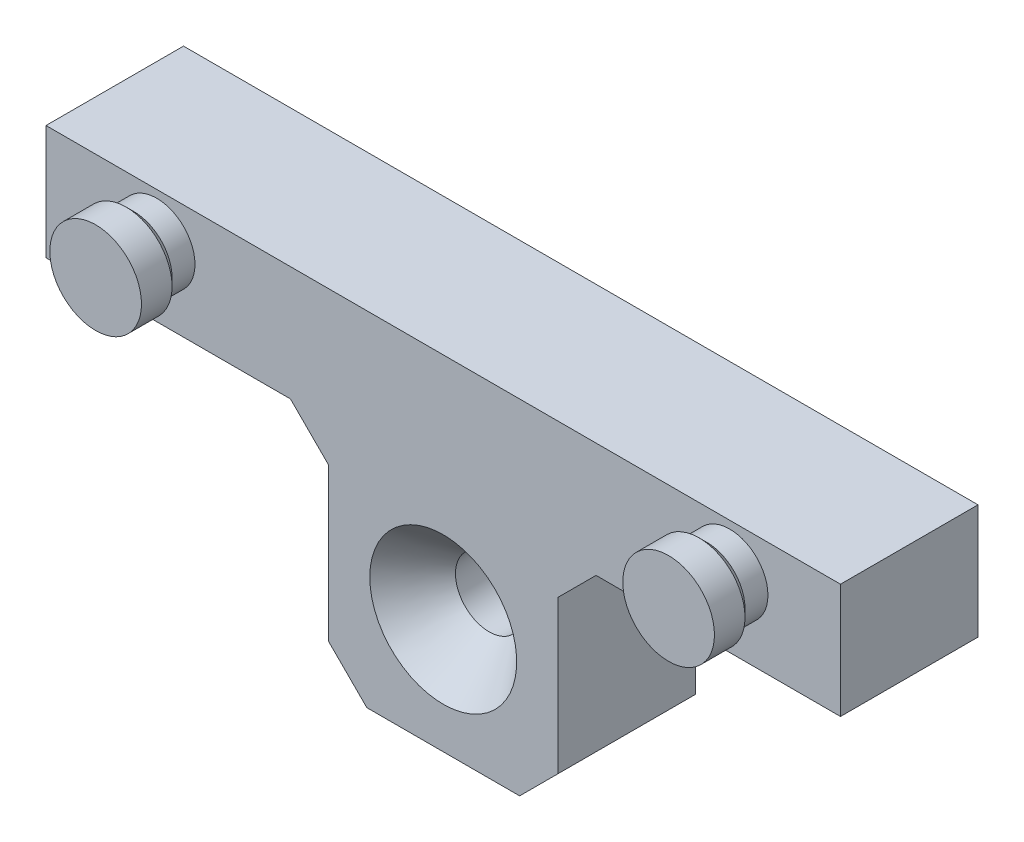
ISO-10303-21;
HEADER;
FILE_DESCRIPTION(('STEP AP214'),'2;1');
FILE_NAME('part.step','',(''),(''),'','','');
FILE_SCHEMA(('AUTOMOTIVE_DESIGN { 1 0 10303 214 1 1 1 1 }'));
ENDSEC;
DATA;
#1=APPLICATION_CONTEXT('core data for automotive mechanical design processes');
#2=APPLICATION_PROTOCOL_DEFINITION('international standard','automotive_design',2000,#1);
#3=PRODUCT_CONTEXT('',#1,'mechanical');
#4=PRODUCT('Part','Part','',(#3));
#5=PRODUCT_RELATED_PRODUCT_CATEGORY('part','',(#4));
#6=PRODUCT_DEFINITION_FORMATION('','',#4);
#7=PRODUCT_DEFINITION_CONTEXT('part definition',#1,'design');
#8=PRODUCT_DEFINITION('design','',#6,#7);
#9=PRODUCT_DEFINITION_SHAPE('','',#8);
#10=(LENGTH_UNIT() NAMED_UNIT(*) SI_UNIT(.MILLI.,.METRE.));
#11=(NAMED_UNIT(*) PLANE_ANGLE_UNIT() SI_UNIT($,.RADIAN.));
#12=(NAMED_UNIT(*) SI_UNIT($,.STERADIAN.) SOLID_ANGLE_UNIT());
#13=UNCERTAINTY_MEASURE_WITH_UNIT(LENGTH_MEASURE(1.E-05),#10,'distance_accuracy_value','');
#14=(GEOMETRIC_REPRESENTATION_CONTEXT(3) GLOBAL_UNCERTAINTY_ASSIGNED_CONTEXT((#13)) GLOBAL_UNIT_ASSIGNED_CONTEXT((#10,
#11,#12)) REPRESENTATION_CONTEXT('',''));
#15=CARTESIAN_POINT('',(0.,0.,0.));
#16=DIRECTION('',(0.,0.,1.));
#17=DIRECTION('',(1.,0.,0.));
#18=AXIS2_PLACEMENT_3D('',#15,#16,#17);
#19=CARTESIAN_POINT('',(26.,-15.,9.));
#20=DIRECTION('',(0.,0.,-1.));
#21=DIRECTION('',(-1.,0.,0.));
#22=AXIS2_PLACEMENT_3D('',#19,#20,#21);
#23=CYLINDRICAL_SURFACE('',#22,2.2);
#24=CARTESIAN_POINT('',(26.,-15.,0.));
#25=DIRECTION('',(0.,0.,1.));
#26=DIRECTION('',(1.,0.,0.));
#27=AXIS2_PLACEMENT_3D('',#24,#25,#26);
#28=CIRCLE('',#27,2.2);
#29=CARTESIAN_POINT('',(28.2,-15.,0.));
#30=VERTEX_POINT('',#29);
#31=EDGE_CURVE('E197',#30,#30,#28,.T.);
#32=ORIENTED_EDGE('',*,*,#31,.F.);
#33=EDGE_LOOP('',(#32));
#34=FACE_BOUND('',#33,.T.);
#35=CARTESIAN_POINT('',(26.,-15.,6.));
#36=DIRECTION('',(0.,0.,-1.));
#37=DIRECTION('',(-1.,0.,0.));
#38=AXIS2_PLACEMENT_3D('',#35,#36,#37);
#39=CIRCLE('',#38,2.2);
#40=CARTESIAN_POINT('',(23.8,-15.,6.));
#41=VERTEX_POINT('',#40);
#42=EDGE_CURVE('E655',#41,#41,#39,.T.);
#43=ORIENTED_EDGE('',*,*,#42,.F.);
#44=EDGE_LOOP('',(#43));
#45=FACE_BOUND('',#44,.T.);
#46=ADVANCED_FACE('F48',(#34,#45),#23,.F.);
#47=CARTESIAN_POINT('',(52.,0.,9.));
#48=DIRECTION('',(1.,0.,0.));
#49=DIRECTION('',(0.,0.,-1.));
#50=AXIS2_PLACEMENT_3D('',#47,#48,#49);
#51=PLANE('',#50);
#52=DIRECTION('',(0.,-1.,0.));
#53=VECTOR('',#52,1.);
#54=CARTESIAN_POINT('',(52.,0.,0.));
#55=LINE('',#54,#53);
#56=CARTESIAN_POINT('',(52.,0.,0.));
#57=VERTEX_POINT('',#56);
#58=CARTESIAN_POINT('',(52.,-7.49999999999999,0.));
#59=VERTEX_POINT('',#58);
#60=EDGE_CURVE('E144',#57,#59,#55,.T.);
#61=ORIENTED_EDGE('',*,*,#60,.F.);
#62=DIRECTION('',(0.,0.,-1.));
#63=VECTOR('',#62,1.);
#64=CARTESIAN_POINT('',(52.,0.,9.));
#65=LINE('',#64,#63);
#66=CARTESIAN_POINT('',(52.,0.,9.));
#67=VERTEX_POINT('',#66);
#68=EDGE_CURVE('E138',#67,#57,#65,.T.);
#69=ORIENTED_EDGE('',*,*,#68,.F.);
#70=DIRECTION('',(0.,-1.,0.));
#71=VECTOR('',#70,1.);
#72=CARTESIAN_POINT('',(52.,0.,9.));
#73=LINE('',#72,#71);
#74=CARTESIAN_POINT('',(52.,-7.49999999999999,9.));
#75=VERTEX_POINT('',#74);
#76=EDGE_CURVE('E142',#67,#75,#73,.T.);
#77=ORIENTED_EDGE('',*,*,#76,.T.);
#78=DIRECTION('',(0.,0.,-1.));
#79=VECTOR('',#78,1.);
#80=CARTESIAN_POINT('',(52.,-7.49999999999999,9.));
#81=LINE('',#80,#79);
#82=EDGE_CURVE('E201',#75,#59,#81,.T.);
#83=ORIENTED_EDGE('',*,*,#82,.T.);
#84=EDGE_LOOP('',(#61,#69,#77,#83));
#85=FACE_BOUND('',#84,.T.);
#86=ADVANCED_FACE('F140',(#85),#51,.T.);
#87=CARTESIAN_POINT('',(0.,0.,9.));
#88=DIRECTION('',(0.,1.,0.));
#89=DIRECTION('',(0.,0.,1.));
#90=AXIS2_PLACEMENT_3D('',#87,#88,#89);
#91=PLANE('',#90);
#92=DIRECTION('',(1.,0.,0.));
#93=VECTOR('',#92,1.);
#94=CARTESIAN_POINT('',(0.,0.,0.));
#95=LINE('',#94,#93);
#96=CARTESIAN_POINT('',(0.,0.,0.));
#97=VERTEX_POINT('',#96);
#98=EDGE_CURVE('E179',#97,#57,#95,.T.);
#99=ORIENTED_EDGE('',*,*,#98,.F.);
#100=DIRECTION('',(0.,0.,-1.));
#101=VECTOR('',#100,1.);
#102=CARTESIAN_POINT('',(0.,0.,9.));
#103=LINE('',#102,#101);
#104=CARTESIAN_POINT('',(0.,0.,9.));
#105=VERTEX_POINT('',#104);
#106=EDGE_CURVE('E150',#105,#97,#103,.T.);
#107=ORIENTED_EDGE('',*,*,#106,.F.);
#108=DIRECTION('',(1.,0.,0.));
#109=VECTOR('',#108,1.);
#110=CARTESIAN_POINT('',(0.,0.,9.));
#111=LINE('',#110,#109);
#112=EDGE_CURVE('E156',#105,#67,#111,.T.);
#113=ORIENTED_EDGE('',*,*,#112,.T.);
#114=ORIENTED_EDGE('',*,*,#68,.T.);
#115=EDGE_LOOP('',(#99,#107,#113,#114));
#116=FACE_BOUND('',#115,.T.);
#117=ADVANCED_FACE('F162',(#116),#91,.T.);
#118=CARTESIAN_POINT('',(0.,0.,9.));
#119=DIRECTION('',(1.,0.,0.));
#120=DIRECTION('',(0.,1.,0.));
#121=AXIS2_PLACEMENT_3D('',#118,#119,#120);
#122=PLANE('',#121);
#123=DIRECTION('',(0.,-1.,0.));
#124=VECTOR('',#123,1.);
#125=CARTESIAN_POINT('',(0.,0.,0.));
#126=LINE('',#125,#124);
#127=CARTESIAN_POINT('',(0.,-7.5,0.));
#128=VERTEX_POINT('',#127);
#129=EDGE_CURVE('E182',#97,#128,#126,.T.);
#130=ORIENTED_EDGE('',*,*,#129,.T.);
#131=DIRECTION('',(0.,0.,-1.));
#132=VECTOR('',#131,1.);
#133=CARTESIAN_POINT('',(0.,-7.5,9.));
#134=LINE('',#133,#132);
#135=CARTESIAN_POINT('',(0.,-7.5,9.));
#136=VERTEX_POINT('',#135);
#137=EDGE_CURVE('E203',#136,#128,#134,.T.);
#138=ORIENTED_EDGE('',*,*,#137,.F.);
#139=DIRECTION('',(0.,-1.,0.));
#140=VECTOR('',#139,1.);
#141=CARTESIAN_POINT('',(0.,0.,9.));
#142=LINE('',#141,#140);
#143=EDGE_CURVE('E164',#105,#136,#142,.T.);
#144=ORIENTED_EDGE('',*,*,#143,.F.);
#145=ORIENTED_EDGE('',*,*,#106,.T.);
#146=EDGE_LOOP('',(#130,#138,#144,#145));
#147=FACE_BOUND('',#146,.T.);
#148=ADVANCED_FACE('F280',(#147),#122,.F.);
#149=CARTESIAN_POINT('',(0.,-7.5,9.));
#150=DIRECTION('',(0.,1.,0.));
#151=DIRECTION('',(-1.,0.,0.));
#152=AXIS2_PLACEMENT_3D('',#149,#150,#151);
#153=PLANE('',#152);
#154=DIRECTION('',(1.,0.,0.));
#155=VECTOR('',#154,1.);
#156=CARTESIAN_POINT('',(0.,-7.5,0.));
#157=LINE('',#156,#155);
#158=CARTESIAN_POINT('',(16.,-7.5,0.));
#159=VERTEX_POINT('',#158);
#160=EDGE_CURVE('E185',#128,#159,#157,.T.);
#161=ORIENTED_EDGE('',*,*,#160,.T.);
#162=DIRECTION('',(0.,0.,1.));
#163=VECTOR('',#162,1.);
#164=CARTESIAN_POINT('',(16.,-7.5,9.));
#165=LINE('',#164,#163);
#166=CARTESIAN_POINT('',(16.,-7.5,9.));
#167=VERTEX_POINT('',#166);
#168=EDGE_CURVE('E237',#159,#167,#165,.T.);
#169=ORIENTED_EDGE('',*,*,#168,.T.);
#170=DIRECTION('',(1.,0.,0.));
#171=VECTOR('',#170,1.);
#172=CARTESIAN_POINT('',(0.,-7.5,9.));
#173=LINE('',#172,#171);
#174=EDGE_CURVE('E166',#136,#167,#173,.T.);
#175=ORIENTED_EDGE('',*,*,#174,.F.);
#176=ORIENTED_EDGE('',*,*,#137,.T.);
#177=EDGE_LOOP('',(#161,#169,#175,#176));
#178=FACE_BOUND('',#177,.T.);
#179=ADVANCED_FACE('F251',(#178),#153,.F.);
#180=CARTESIAN_POINT('',(18.5,0.,9.));
#181=DIRECTION('',(1.,0.,0.));
#182=DIRECTION('',(0.,1.,0.));
#183=AXIS2_PLACEMENT_3D('',#180,#181,#182);
#184=PLANE('',#183);
#185=DIRECTION('',(0.,-1.,0.));
#186=VECTOR('',#185,1.);
#187=CARTESIAN_POINT('',(18.5,0.,0.));
#188=LINE('',#187,#186);
#189=CARTESIAN_POINT('',(18.5,-10.,0.));
#190=VERTEX_POINT('',#189);
#191=CARTESIAN_POINT('',(18.5,-20.,0.));
#192=VERTEX_POINT('',#191);
#193=EDGE_CURVE('E188',#190,#192,#188,.T.);
#194=ORIENTED_EDGE('',*,*,#193,.T.);
#195=DIRECTION('',(0.,0.,1.));
#196=VECTOR('',#195,1.);
#197=CARTESIAN_POINT('',(18.5,-20.,9.));
#198=LINE('',#197,#196);
#199=CARTESIAN_POINT('',(18.5,-20.,9.));
#200=VERTEX_POINT('',#199);
#201=EDGE_CURVE('E64',#192,#200,#198,.T.);
#202=ORIENTED_EDGE('',*,*,#201,.T.);
#203=DIRECTION('',(0.,-1.,0.));
#204=VECTOR('',#203,1.);
#205=CARTESIAN_POINT('',(18.5,0.,9.));
#206=LINE('',#205,#204);
#207=CARTESIAN_POINT('',(18.5,-10.,9.));
#208=VERTEX_POINT('',#207);
#209=EDGE_CURVE('E171',#208,#200,#206,.T.);
#210=ORIENTED_EDGE('',*,*,#209,.F.);
#211=DIRECTION('',(0.,0.,-1.));
#212=VECTOR('',#211,1.);
#213=CARTESIAN_POINT('',(18.5,-10.,0.));
#214=LINE('',#213,#212);
#215=EDGE_CURVE('E233',#208,#190,#214,.T.);
#216=ORIENTED_EDGE('',*,*,#215,.T.);
#217=EDGE_LOOP('',(#194,#202,#210,#216));
#218=FACE_BOUND('',#217,.T.);
#219=ADVANCED_FACE('F253',(#218),#184,.F.);
#220=CARTESIAN_POINT('',(0.,-22.5,9.));
#221=DIRECTION('',(0.,1.,0.));
#222=DIRECTION('',(0.,0.,1.));
#223=AXIS2_PLACEMENT_3D('',#220,#221,#222);
#224=PLANE('',#223);
#225=DIRECTION('',(1.,0.,0.));
#226=VECTOR('',#225,1.);
#227=CARTESIAN_POINT('',(0.,-22.5,0.));
#228=LINE('',#227,#226);
#229=CARTESIAN_POINT('',(21.,-22.5,0.));
#230=VERTEX_POINT('',#229);
#231=CARTESIAN_POINT('',(31.,-22.5,0.));
#232=VERTEX_POINT('',#231);
#233=EDGE_CURVE('E191',#230,#232,#228,.T.);
#234=ORIENTED_EDGE('',*,*,#233,.T.);
#235=DIRECTION('',(0.,0.,1.));
#236=VECTOR('',#235,1.);
#237=CARTESIAN_POINT('',(31.,-22.5,9.));
#238=LINE('',#237,#236);
#239=CARTESIAN_POINT('',(31.,-22.5,9.));
#240=VERTEX_POINT('',#239);
#241=EDGE_CURVE('E227',#232,#240,#238,.T.);
#242=ORIENTED_EDGE('',*,*,#241,.T.);
#243=DIRECTION('',(1.,0.,0.));
#244=VECTOR('',#243,1.);
#245=CARTESIAN_POINT('',(0.,-22.5,9.));
#246=LINE('',#245,#244);
#247=CARTESIAN_POINT('',(21.,-22.5,9.));
#248=VERTEX_POINT('',#247);
#249=EDGE_CURVE('E173',#248,#240,#246,.T.);
#250=ORIENTED_EDGE('',*,*,#249,.F.);
#251=DIRECTION('',(0.,0.,-1.));
#252=VECTOR('',#251,1.);
#253=CARTESIAN_POINT('',(21.,-22.5,9.));
#254=LINE('',#253,#252);
#255=EDGE_CURVE('E224',#248,#230,#254,.T.);
#256=ORIENTED_EDGE('',*,*,#255,.T.);
#257=EDGE_LOOP('',(#234,#242,#250,#256));
#258=FACE_BOUND('',#257,.T.);
#259=ADVANCED_FACE('F261',(#258),#224,.F.);
#260=CARTESIAN_POINT('',(33.5,0.,9.));
#261=DIRECTION('',(1.,0.,0.));
#262=DIRECTION('',(0.,0.,-1.));
#263=AXIS2_PLACEMENT_3D('',#260,#261,#262);
#264=PLANE('',#263);
#265=DIRECTION('',(0.,-1.,0.));
#266=VECTOR('',#265,1.);
#267=CARTESIAN_POINT('',(33.5,0.,0.));
#268=LINE('',#267,#266);
#269=CARTESIAN_POINT('',(33.5,-9.99999999999999,0.));
#270=VERTEX_POINT('',#269);
#271=CARTESIAN_POINT('',(33.5,-20.,0.));
#272=VERTEX_POINT('',#271);
#273=EDGE_CURVE('E194',#270,#272,#268,.T.);
#274=ORIENTED_EDGE('',*,*,#273,.F.);
#275=DIRECTION('',(0.,0.,1.));
#276=VECTOR('',#275,1.);
#277=CARTESIAN_POINT('',(33.5,-9.99999999999999,9.));
#278=LINE('',#277,#276);
#279=CARTESIAN_POINT('',(33.5,-9.99999999999999,9.));
#280=VERTEX_POINT('',#279);
#281=EDGE_CURVE('E218',#270,#280,#278,.T.);
#282=ORIENTED_EDGE('',*,*,#281,.T.);
#283=DIRECTION('',(0.,-1.,0.));
#284=VECTOR('',#283,1.);
#285=CARTESIAN_POINT('',(33.5,0.,9.));
#286=LINE('',#285,#284);
#287=CARTESIAN_POINT('',(33.5,-20.,9.));
#288=VERTEX_POINT('',#287);
#289=EDGE_CURVE('E175',#280,#288,#286,.T.);
#290=ORIENTED_EDGE('',*,*,#289,.T.);
#291=DIRECTION('',(0.,0.,-1.));
#292=VECTOR('',#291,1.);
#293=CARTESIAN_POINT('',(33.5,-20.,0.));
#294=LINE('',#293,#292);
#295=EDGE_CURVE('E215',#288,#272,#294,.T.);
#296=ORIENTED_EDGE('',*,*,#295,.T.);
#297=EDGE_LOOP('',(#274,#282,#290,#296));
#298=FACE_BOUND('',#297,.T.);
#299=ADVANCED_FACE('F269',(#298),#264,.T.);
#300=CARTESIAN_POINT('',(36.,-7.5,9.));
#301=VERTEX_POINT('',#300);
#302=EDGE_CURVE('E158',#301,#75,#173,.T.);
#303=ORIENTED_EDGE('',*,*,#302,.F.);
#304=DIRECTION('',(0.,0.,-1.));
#305=VECTOR('',#304,1.);
#306=CARTESIAN_POINT('',(36.,-7.5,9.));
#307=LINE('',#306,#305);
#308=CARTESIAN_POINT('',(36.,-7.5,0.));
#309=VERTEX_POINT('',#308);
#310=EDGE_CURVE('E212',#301,#309,#307,.T.);
#311=ORIENTED_EDGE('',*,*,#310,.T.);
#312=EDGE_CURVE('E189',#309,#59,#157,.T.);
#313=ORIENTED_EDGE('',*,*,#312,.T.);
#314=ORIENTED_EDGE('',*,*,#82,.F.);
#315=EDGE_LOOP('',(#303,#311,#313,#314));
#316=FACE_BOUND('',#315,.T.);
#317=ADVANCED_FACE('F278',(#316),#153,.F.);
#318=CARTESIAN_POINT('',(0.,0.,9.));
#319=DIRECTION('',(0.,0.,1.));
#320=DIRECTION('',(1.,0.,0.));
#321=AXIS2_PLACEMENT_3D('',#318,#319,#320);
#322=PLANE('',#321);
#323=CARTESIAN_POINT('',(26.,-15.,9.));
#324=DIRECTION('',(0.,0.,-1.));
#325=DIRECTION('',(-1.,0.,0.));
#326=AXIS2_PLACEMENT_3D('',#323,#324,#325);
#327=CIRCLE('',#326,4.80786021344867);
#328=CARTESIAN_POINT('',(21.1921397865513,-15.,9.));
#329=VERTEX_POINT('',#328);
#330=EDGE_CURVE('E658',#329,#329,#327,.T.);
#331=ORIENTED_EDGE('',*,*,#330,.T.);
#332=EDGE_LOOP('',(#331));
#333=FACE_BOUND('',#332,.T.);
#334=CARTESIAN_POINT('',(44.75,-3.,9.));
#335=DIRECTION('',(0.,0.,1.));
#336=DIRECTION('',(1.,0.,0.));
#337=AXIS2_PLACEMENT_3D('',#334,#335,#336);
#338=CIRCLE('',#337,2.5);
#339=CARTESIAN_POINT('',(47.25,-3.,9.));
#340=VERTEX_POINT('',#339);
#341=EDGE_CURVE('E200',#340,#340,#338,.T.);
#342=ORIENTED_EDGE('',*,*,#341,.F.);
#343=EDGE_LOOP('',(#342));
#344=FACE_BOUND('',#343,.T.);
#345=CARTESIAN_POINT('',(7.25,-3.,9.));
#346=DIRECTION('',(0.,0.,1.));
#347=DIRECTION('',(1.,0.,0.));
#348=AXIS2_PLACEMENT_3D('',#345,#346,#347);
#349=CIRCLE('',#348,2.5);
#350=CARTESIAN_POINT('',(9.75,-3.,9.));
#351=VERTEX_POINT('',#350);
#352=EDGE_CURVE('E160',#351,#351,#349,.T.);
#353=ORIENTED_EDGE('',*,*,#352,.F.);
#354=EDGE_LOOP('',(#353));
#355=FACE_BOUND('',#354,.T.);
#356=ORIENTED_EDGE('',*,*,#249,.T.);
#357=DIRECTION('',(0.707106781186549,0.707106781186546,0.));
#358=VECTOR('',#357,1.);
#359=CARTESIAN_POINT('',(26.7499999999999,-26.75,9.));
#360=LINE('',#359,#358);
#361=EDGE_CURVE('E231',#240,#288,#360,.T.);
#362=ORIENTED_EDGE('',*,*,#361,.T.);
#363=ORIENTED_EDGE('',*,*,#289,.F.);
#364=DIRECTION('',(0.70710678118655,0.707106781186545,0.));
#365=VECTOR('',#364,1.);
#366=CARTESIAN_POINT('',(36.,-7.5,9.));
#367=LINE('',#366,#365);
#368=EDGE_CURVE('E241',#280,#301,#367,.T.);
#369=ORIENTED_EDGE('',*,*,#368,.T.);
#370=ORIENTED_EDGE('',*,*,#302,.T.);
#371=ORIENTED_EDGE('',*,*,#76,.F.);
#372=ORIENTED_EDGE('',*,*,#112,.F.);
#373=ORIENTED_EDGE('',*,*,#143,.T.);
#374=ORIENTED_EDGE('',*,*,#174,.T.);
#375=DIRECTION('',(-0.707106781186544,0.707106781186551,0.));
#376=VECTOR('',#375,1.);
#377=CARTESIAN_POINT('',(18.5,-10.,9.));
#378=LINE('',#377,#376);
#379=EDGE_CURVE('E12',#167,#208,#378,.F.);
#380=ORIENTED_EDGE('',*,*,#379,.T.);
#381=ORIENTED_EDGE('',*,*,#209,.T.);
#382=DIRECTION('',(-0.707106781186547,0.707106781186549,0.));
#383=VECTOR('',#382,1.);
#384=CARTESIAN_POINT('',(-0.749999999999962,-0.74999999999996,9.));
#385=LINE('',#384,#383);
#386=EDGE_CURVE('E229',#200,#248,#385,.F.);
#387=ORIENTED_EDGE('',*,*,#386,.T.);
#388=EDGE_LOOP('',(#356,#362,#363,#369,#370,#371,#372,#373,#374,#380,#381,#387));
#389=FACE_BOUND('',#388,.T.);
#390=ADVANCED_FACE('F154',(#333,#344,#355,#389),#322,.T.);
#391=CARTESIAN_POINT('',(0.,0.,0.));
#392=DIRECTION('',(0.,0.,1.));
#393=DIRECTION('',(1.,0.,0.));
#394=AXIS2_PLACEMENT_3D('',#391,#392,#393);
#395=PLANE('',#394);
#396=ORIENTED_EDGE('',*,*,#273,.T.);
#397=DIRECTION('',(-0.707106781186549,-0.707106781186546,0.));
#398=VECTOR('',#397,1.);
#399=CARTESIAN_POINT('',(33.5,-20.,0.));
#400=LINE('',#399,#398);
#401=EDGE_CURVE('E222',#272,#232,#400,.T.);
#402=ORIENTED_EDGE('',*,*,#401,.T.);
#403=ORIENTED_EDGE('',*,*,#233,.F.);
#404=DIRECTION('',(0.707106781186547,-0.707106781186549,0.));
#405=VECTOR('',#404,1.);
#406=CARTESIAN_POINT('',(21.,-22.5,0.));
#407=LINE('',#406,#405);
#408=EDGE_CURVE('E220',#230,#192,#407,.F.);
#409=ORIENTED_EDGE('',*,*,#408,.T.);
#410=ORIENTED_EDGE('',*,*,#193,.F.);
#411=DIRECTION('',(0.707106781186544,-0.707106781186551,0.));
#412=VECTOR('',#411,1.);
#413=CARTESIAN_POINT('',(4.25000000000009,4.25000000000004,0.));
#414=LINE('',#413,#412);
#415=EDGE_CURVE('E57',#190,#159,#414,.F.);
#416=ORIENTED_EDGE('',*,*,#415,.T.);
#417=ORIENTED_EDGE('',*,*,#160,.F.);
#418=ORIENTED_EDGE('',*,*,#129,.F.);
#419=ORIENTED_EDGE('',*,*,#98,.T.);
#420=ORIENTED_EDGE('',*,*,#60,.T.);
#421=ORIENTED_EDGE('',*,*,#312,.F.);
#422=DIRECTION('',(-0.70710678118655,-0.707106781186545,0.));
#423=VECTOR('',#422,1.);
#424=CARTESIAN_POINT('',(21.7499999999999,-21.75,0.));
#425=LINE('',#424,#423);
#426=EDGE_CURVE('E239',#309,#270,#425,.T.);
#427=ORIENTED_EDGE('',*,*,#426,.T.);
#428=EDGE_LOOP('',(#396,#402,#403,#409,#410,#416,#417,#418,#419,#420,#421,#427));
#429=FACE_BOUND('',#428,.T.);
#430=ORIENTED_EDGE('',*,*,#31,.T.);
#431=EDGE_LOOP('',(#430));
#432=FACE_BOUND('',#431,.T.);
#433=ADVANCED_FACE('F244',(#429,#432),#395,.F.);
#434=CARTESIAN_POINT('',(7.25,-3.,10.5));
#435=DIRECTION('',(0.,0.,-1.));
#436=DIRECTION('',(-1.,0.,0.));
#437=AXIS2_PLACEMENT_3D('',#434,#435,#436);
#438=CYLINDRICAL_SURFACE('',#437,2.5);
#439=ORIENTED_EDGE('',*,*,#352,.T.);
#440=EDGE_LOOP('',(#439));
#441=FACE_BOUND('',#440,.T.);
#442=CARTESIAN_POINT('',(7.25,-3.,10.5));
#443=DIRECTION('',(0.,0.,1.));
#444=DIRECTION('',(1.,0.,0.));
#445=AXIS2_PLACEMENT_3D('',#442,#443,#444);
#446=CIRCLE('',#445,2.5);
#447=CARTESIAN_POINT('',(9.75,-3.,10.5));
#448=VERTEX_POINT('',#447);
#449=EDGE_CURVE('E180',#448,#448,#446,.T.);
#450=ORIENTED_EDGE('',*,*,#449,.F.);
#451=EDGE_LOOP('',(#450));
#452=FACE_BOUND('',#451,.T.);
#453=ADVANCED_FACE('F335',(#441,#452),#438,.T.);
#454=CARTESIAN_POINT('',(44.75,-3.,10.5));
#455=DIRECTION('',(0.,0.,-1.));
#456=DIRECTION('',(-1.,0.,0.));
#457=AXIS2_PLACEMENT_3D('',#454,#455,#456);
#458=CYLINDRICAL_SURFACE('',#457,2.5);
#459=ORIENTED_EDGE('',*,*,#341,.T.);
#460=EDGE_LOOP('',(#459));
#461=FACE_BOUND('',#460,.T.);
#462=CARTESIAN_POINT('',(44.75,-3.,10.5));
#463=DIRECTION('',(0.,0.,1.));
#464=DIRECTION('',(1.,0.,0.));
#465=AXIS2_PLACEMENT_3D('',#462,#463,#464);
#466=CIRCLE('',#465,2.5);
#467=CARTESIAN_POINT('',(47.25,-3.,10.5));
#468=VERTEX_POINT('',#467);
#469=EDGE_CURVE('E661',#468,#468,#466,.T.);
#470=ORIENTED_EDGE('',*,*,#469,.F.);
#471=EDGE_LOOP('',(#470));
#472=FACE_BOUND('',#471,.T.);
#473=ADVANCED_FACE('F342',(#461,#472),#458,.T.);
#474=CARTESIAN_POINT('',(26.,-15.,9.));
#475=DIRECTION('',(0.,0.,1.));
#476=DIRECTION('',(1.,0.,0.));
#477=AXIS2_PLACEMENT_3D('',#474,#475,#476);
#478=CONICAL_SURFACE('',#477,4.80786021344867,0.715584993317672);
#479=ORIENTED_EDGE('',*,*,#42,.T.);
#480=EDGE_LOOP('',(#479));
#481=FACE_BOUND('',#480,.T.);
#482=ORIENTED_EDGE('',*,*,#330,.F.);
#483=EDGE_LOOP('',(#482));
#484=FACE_BOUND('',#483,.T.);
#485=ADVANCED_FACE('F350',(#481,#484),#478,.F.);
#486=CARTESIAN_POINT('',(7.25,-3.,13.));
#487=DIRECTION('',(0.,0.,-1.));
#488=DIRECTION('',(-1.,0.,0.));
#489=AXIS2_PLACEMENT_3D('',#486,#487,#488);
#490=CYLINDRICAL_SURFACE('',#489,3.);
#491=CARTESIAN_POINT('',(7.25,-3.,11.));
#492=DIRECTION('',(0.,0.,1.));
#493=DIRECTION('',(1.,0.,0.));
#494=AXIS2_PLACEMENT_3D('',#491,#492,#493);
#495=CIRCLE('',#494,3.);
#496=CARTESIAN_POINT('',(10.25,-3.,11.));
#497=VERTEX_POINT('',#496);
#498=EDGE_CURVE('E209',#497,#497,#495,.T.);
#499=ORIENTED_EDGE('',*,*,#498,.T.);
#500=EDGE_LOOP('',(#499));
#501=FACE_BOUND('',#500,.T.);
#502=CARTESIAN_POINT('',(7.25,-3.,13.));
#503=DIRECTION('',(0.,0.,1.));
#504=DIRECTION('',(1.,0.,0.));
#505=AXIS2_PLACEMENT_3D('',#502,#503,#504);
#506=CIRCLE('',#505,3.);
#507=CARTESIAN_POINT('',(10.25,-3.,13.));
#508=VERTEX_POINT('',#507);
#509=EDGE_CURVE('E652',#508,#508,#506,.T.);
#510=ORIENTED_EDGE('',*,*,#509,.F.);
#511=EDGE_LOOP('',(#510));
#512=FACE_BOUND('',#511,.T.);
#513=ADVANCED_FACE('F358',(#501,#512),#490,.T.);
#514=CARTESIAN_POINT('',(7.25,-3.,13.));
#515=DIRECTION('',(0.,0.,1.));
#516=DIRECTION('',(1.,0.,0.));
#517=AXIS2_PLACEMENT_3D('',#514,#515,#516);
#518=PLANE('',#517);
#519=ORIENTED_EDGE('',*,*,#509,.T.);
#520=EDGE_LOOP('',(#519));
#521=FACE_BOUND('',#520,.T.);
#522=ADVANCED_FACE('F367',(#521),#518,.T.);
#523=CARTESIAN_POINT('',(44.75,-3.,13.));
#524=DIRECTION('',(0.,0.,-1.));
#525=DIRECTION('',(-1.,0.,0.));
#526=AXIS2_PLACEMENT_3D('',#523,#524,#525);
#527=CYLINDRICAL_SURFACE('',#526,3.);
#528=CARTESIAN_POINT('',(44.75,-3.,11.));
#529=DIRECTION('',(0.,0.,1.));
#530=DIRECTION('',(1.,0.,0.));
#531=AXIS2_PLACEMENT_3D('',#528,#529,#530);
#532=CIRCLE('',#531,3.);
#533=CARTESIAN_POINT('',(47.75,-3.,11.));
#534=VERTEX_POINT('',#533);
#535=EDGE_CURVE('E149',#534,#534,#532,.T.);
#536=ORIENTED_EDGE('',*,*,#535,.T.);
#537=EDGE_LOOP('',(#536));
#538=FACE_BOUND('',#537,.T.);
#539=CARTESIAN_POINT('',(44.75,-3.,13.));
#540=DIRECTION('',(0.,0.,1.));
#541=DIRECTION('',(1.,0.,0.));
#542=AXIS2_PLACEMENT_3D('',#539,#540,#541);
#543=CIRCLE('',#542,3.);
#544=CARTESIAN_POINT('',(47.75,-3.,13.));
#545=VERTEX_POINT('',#544);
#546=EDGE_CURVE('E649',#545,#545,#543,.T.);
#547=ORIENTED_EDGE('',*,*,#546,.F.);
#548=EDGE_LOOP('',(#547));
#549=FACE_BOUND('',#548,.T.);
#550=ADVANCED_FACE('F376',(#538,#549),#527,.T.);
#551=CARTESIAN_POINT('',(44.75,-3.,13.));
#552=DIRECTION('',(0.,0.,1.));
#553=DIRECTION('',(1.,0.,0.));
#554=AXIS2_PLACEMENT_3D('',#551,#552,#553);
#555=PLANE('',#554);
#556=ORIENTED_EDGE('',*,*,#546,.T.);
#557=EDGE_LOOP('',(#556));
#558=FACE_BOUND('',#557,.T.);
#559=ADVANCED_FACE('F383',(#558),#555,.T.);
#560=CARTESIAN_POINT('',(44.75,-3.,11.));
#561=DIRECTION('',(0.,0.,1.));
#562=DIRECTION('',(1.,0.,0.));
#563=AXIS2_PLACEMENT_3D('',#560,#561,#562);
#564=CONICAL_SURFACE('',#563,3.,0.785398163397452);
#565=ORIENTED_EDGE('',*,*,#469,.T.);
#566=EDGE_LOOP('',(#565));
#567=FACE_BOUND('',#566,.T.);
#568=ORIENTED_EDGE('',*,*,#535,.F.);
#569=EDGE_LOOP('',(#568));
#570=FACE_BOUND('',#569,.T.);
#571=ADVANCED_FACE('F391',(#567,#570),#564,.T.);
#572=CARTESIAN_POINT('',(7.25,-3.,11.));
#573=DIRECTION('',(0.,0.,1.));
#574=DIRECTION('',(1.,0.,0.));
#575=AXIS2_PLACEMENT_3D('',#572,#573,#574);
#576=CONICAL_SURFACE('',#575,3.,0.785398163397445);
#577=ORIENTED_EDGE('',*,*,#449,.T.);
#578=EDGE_LOOP('',(#577));
#579=FACE_BOUND('',#578,.T.);
#580=ORIENTED_EDGE('',*,*,#498,.F.);
#581=EDGE_LOOP('',(#580));
#582=FACE_BOUND('',#581,.T.);
#583=ADVANCED_FACE('F398',(#579,#582),#576,.T.);
#584=CARTESIAN_POINT('',(36.,-7.5,9.));
#585=DIRECTION('',(-0.707106781186545,0.70710678118655,0.));
#586=DIRECTION('',(0.,0.,-1.));
#587=AXIS2_PLACEMENT_3D('',#584,#585,#586);
#588=PLANE('',#587);
#589=ORIENTED_EDGE('',*,*,#368,.F.);
#590=ORIENTED_EDGE('',*,*,#281,.F.);
#591=ORIENTED_EDGE('',*,*,#426,.F.);
#592=ORIENTED_EDGE('',*,*,#310,.F.);
#593=EDGE_LOOP('',(#589,#590,#591,#592));
#594=FACE_BOUND('',#593,.T.);
#595=ADVANCED_FACE('F275',(#594),#588,.F.);
#596=CARTESIAN_POINT('',(33.5,-20.,9.));
#597=DIRECTION('',(0.707106781186546,-0.707106781186549,0.));
#598=DIRECTION('',(0.,0.,1.));
#599=AXIS2_PLACEMENT_3D('',#596,#597,#598);
#600=PLANE('',#599);
#601=ORIENTED_EDGE('',*,*,#361,.F.);
#602=ORIENTED_EDGE('',*,*,#241,.F.);
#603=ORIENTED_EDGE('',*,*,#401,.F.);
#604=ORIENTED_EDGE('',*,*,#295,.F.);
#605=EDGE_LOOP('',(#601,#602,#603,#604));
#606=FACE_BOUND('',#605,.T.);
#607=ADVANCED_FACE('F267',(#606),#600,.T.);
#608=CARTESIAN_POINT('',(21.,-22.5,9.));
#609=DIRECTION('',(0.707106781186548,0.707106781186546,0.));
#610=DIRECTION('',(0.,0.,-1.));
#611=AXIS2_PLACEMENT_3D('',#608,#609,#610);
#612=PLANE('',#611);
#613=ORIENTED_EDGE('',*,*,#386,.F.);
#614=ORIENTED_EDGE('',*,*,#201,.F.);
#615=ORIENTED_EDGE('',*,*,#408,.F.);
#616=ORIENTED_EDGE('',*,*,#255,.F.);
#617=EDGE_LOOP('',(#613,#614,#615,#616));
#618=FACE_BOUND('',#617,.T.);
#619=ADVANCED_FACE('F258',(#618),#612,.F.);
#620=CARTESIAN_POINT('',(18.5,-10.,9.));
#621=DIRECTION('',(-0.707106781186551,-0.707106781186543,0.));
#622=DIRECTION('',(0.,0.,1.));
#623=AXIS2_PLACEMENT_3D('',#620,#621,#622);
#624=PLANE('',#623);
#625=ORIENTED_EDGE('',*,*,#379,.F.);
#626=ORIENTED_EDGE('',*,*,#168,.F.);
#627=ORIENTED_EDGE('',*,*,#415,.F.);
#628=ORIENTED_EDGE('',*,*,#215,.F.);
#629=EDGE_LOOP('',(#625,#626,#627,#628));
#630=FACE_BOUND('',#629,.T.);
#631=ADVANCED_FACE('F51',(#630),#624,.T.);
#632=CLOSED_SHELL('',(#46,#86,#117,#148,#179,#219,#259,#299,#317,#390,#433,#453,#473,#485,#513,
#522,#550,#559,#571,#583,#595,#607,#619,#631));
#633=CARTESIAN_POINT('',(7.25,-3.,16.5355339059327));
#634=DIRECTION('',(0.,0.,-1.));
#635=DIRECTION('',(-1.,0.,0.));
#636=AXIS2_PLACEMENT_3D('',#633,#634,#635);
#637=CYLINDRICAL_SURFACE('',#636,1.25);
#638=CARTESIAN_POINT('',(7.25,-3.,11.));
#639=DIRECTION('',(0.,0.,1.));
#640=DIRECTION('',(1.,0.,0.));
#641=AXIS2_PLACEMENT_3D('',#638,#639,#640);
#642=CIRCLE('',#641,1.25);
#643=CARTESIAN_POINT('',(8.5,-3.,11.));
#644=VERTEX_POINT('',#643);
#645=EDGE_CURVE('E643',#644,#644,#642,.T.);
#646=ORIENTED_EDGE('',*,*,#645,.T.);
#647=EDGE_LOOP('',(#646));
#648=FACE_BOUND('',#647,.T.);
#649=CARTESIAN_POINT('',(7.25,-3.,2.));
#650=DIRECTION('',(0.,0.,1.));
#651=DIRECTION('',(1.,0.,0.));
#652=AXIS2_PLACEMENT_3D('',#649,#650,#651);
#653=CIRCLE('',#652,1.25);
#654=CARTESIAN_POINT('',(8.5,-3.,2.));
#655=VERTEX_POINT('',#654);
#656=EDGE_CURVE('E639',#655,#655,#653,.F.);
#657=ORIENTED_EDGE('',*,*,#656,.T.);
#658=EDGE_LOOP('',(#657));
#659=FACE_BOUND('',#658,.T.);
#660=ADVANCED_FACE('F432',(#648,#659),#637,.F.);
#661=CARTESIAN_POINT('',(7.25,-3.,11.));
#662=DIRECTION('',(0.,0.,1.));
#663=DIRECTION('',(1.,0.,0.));
#664=AXIS2_PLACEMENT_3D('',#661,#662,#663);
#665=PLANE('',#664);
#666=ORIENTED_EDGE('',*,*,#645,.F.);
#667=EDGE_LOOP('',(#666));
#668=FACE_BOUND('',#667,.T.);
#669=ADVANCED_FACE('F435',(#668),#665,.F.);
#670=CARTESIAN_POINT('',(0.,0.,2.));
#671=DIRECTION('',(0.,0.,1.));
#672=DIRECTION('',(1.,0.,0.));
#673=AXIS2_PLACEMENT_3D('',#670,#671,#672);
#674=PLANE('',#673);
#675=ORIENTED_EDGE('',*,*,#656,.F.);
#676=EDGE_LOOP('',(#675));
#677=FACE_BOUND('',#676,.T.);
#678=ADVANCED_FACE('F444',(#677),#674,.T.);
#679=CLOSED_SHELL('',(#660,#669,#678));
#680=CARTESIAN_POINT('',(44.75,-3.,16.5355339059327));
#681=DIRECTION('',(0.,0.,-1.));
#682=DIRECTION('',(-1.,0.,0.));
#683=AXIS2_PLACEMENT_3D('',#680,#681,#682);
#684=CYLINDRICAL_SURFACE('',#683,1.25);
#685=CARTESIAN_POINT('',(44.75,-3.,11.));
#686=DIRECTION('',(0.,0.,1.));
#687=DIRECTION('',(1.,0.,0.));
#688=AXIS2_PLACEMENT_3D('',#685,#686,#687);
#689=CIRCLE('',#688,1.25);
#690=CARTESIAN_POINT('',(46.,-3.,11.));
#691=VERTEX_POINT('',#690);
#692=EDGE_CURVE('E640',#691,#691,#689,.T.);
#693=ORIENTED_EDGE('',*,*,#692,.T.);
#694=EDGE_LOOP('',(#693));
#695=FACE_BOUND('',#694,.T.);
#696=CARTESIAN_POINT('',(44.75,-3.,2.));
#697=DIRECTION('',(0.,0.,1.));
#698=DIRECTION('',(1.,0.,0.));
#699=AXIS2_PLACEMENT_3D('',#696,#697,#698);
#700=CIRCLE('',#699,1.25);
#701=CARTESIAN_POINT('',(46.,-3.,2.));
#702=VERTEX_POINT('',#701);
#703=EDGE_CURVE('E637',#702,#702,#700,.F.);
#704=ORIENTED_EDGE('',*,*,#703,.T.);
#705=EDGE_LOOP('',(#704));
#706=FACE_BOUND('',#705,.T.);
#707=ADVANCED_FACE('F457',(#695,#706),#684,.F.);
#708=CARTESIAN_POINT('',(7.25,-3.,11.));
#709=DIRECTION('',(0.,0.,1.));
#710=DIRECTION('',(1.,0.,0.));
#711=AXIS2_PLACEMENT_3D('',#708,#709,#710);
#712=PLANE('',#711);
#713=ORIENTED_EDGE('',*,*,#692,.F.);
#714=EDGE_LOOP('',(#713));
#715=FACE_BOUND('',#714,.T.);
#716=ADVANCED_FACE('F460',(#715),#712,.F.);
#717=CARTESIAN_POINT('',(0.,0.,2.));
#718=DIRECTION('',(0.,0.,1.));
#719=DIRECTION('',(1.,0.,0.));
#720=AXIS2_PLACEMENT_3D('',#717,#718,#719);
#721=PLANE('',#720);
#722=ORIENTED_EDGE('',*,*,#703,.F.);
#723=EDGE_LOOP('',(#722));
#724=FACE_BOUND('',#723,.T.);
#725=ADVANCED_FACE('F470',(#724),#721,.T.);
#726=CLOSED_SHELL('',(#707,#716,#725));
#727=ORIENTED_CLOSED_SHELL('',*,#679,.T.);
#728=ORIENTED_CLOSED_SHELL('',*,#726,.T.);
#729=BREP_WITH_VOIDS('B2',#632,(#727,#728));
#730=ADVANCED_BREP_SHAPE_REPRESENTATION('',(#18,#729),#14);
#731=SHAPE_DEFINITION_REPRESENTATION(#9,#730);
ENDSEC;
END-ISO-10303-21;
